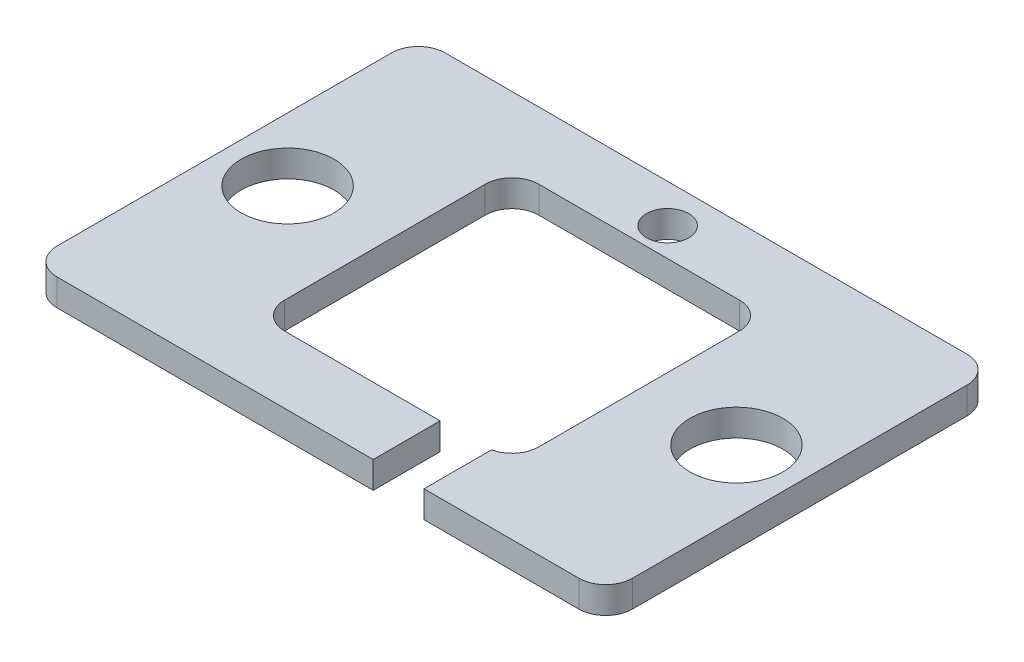
ISO-10303-21;
HEADER;
FILE_DESCRIPTION(('STEP AP214'),'2;1');
FILE_NAME('part.step','',(''),(''),'','','');
FILE_SCHEMA(('AUTOMOTIVE_DESIGN { 1 0 10303 214 1 1 1 1 }'));
ENDSEC;
DATA;
#1=APPLICATION_CONTEXT('core data for automotive mechanical design processes');
#2=APPLICATION_PROTOCOL_DEFINITION('international standard','automotive_design',2000,#1);
#3=PRODUCT_CONTEXT('',#1,'mechanical');
#4=PRODUCT('Part','Part','',(#3));
#5=PRODUCT_RELATED_PRODUCT_CATEGORY('part','',(#4));
#6=PRODUCT_DEFINITION_FORMATION('','',#4);
#7=PRODUCT_DEFINITION_CONTEXT('part definition',#1,'design');
#8=PRODUCT_DEFINITION('design','',#6,#7);
#9=PRODUCT_DEFINITION_SHAPE('','',#8);
#10=(LENGTH_UNIT() NAMED_UNIT(*) SI_UNIT(.MILLI.,.METRE.));
#11=(NAMED_UNIT(*) PLANE_ANGLE_UNIT() SI_UNIT($,.RADIAN.));
#12=(NAMED_UNIT(*) SI_UNIT($,.STERADIAN.) SOLID_ANGLE_UNIT());
#13=UNCERTAINTY_MEASURE_WITH_UNIT(LENGTH_MEASURE(1.E-05),#10,'distance_accuracy_value','');
#14=(GEOMETRIC_REPRESENTATION_CONTEXT(3) GLOBAL_UNCERTAINTY_ASSIGNED_CONTEXT((#13)) GLOBAL_UNIT_ASSIGNED_CONTEXT((#10,
#11,#12)) REPRESENTATION_CONTEXT('',''));
#15=CARTESIAN_POINT('',(0.,0.,0.));
#16=DIRECTION('',(0.,0.,1.));
#17=DIRECTION('',(1.,0.,0.));
#18=AXIS2_PLACEMENT_3D('',#15,#16,#17);
#19=CARTESIAN_POINT('',(-19.5,2.,14.5));
#20=DIRECTION('',(0.,0.,-1.));
#21=DIRECTION('',(-1.,0.,0.));
#22=AXIS2_PLACEMENT_3D('',#19,#20,#21);
#23=PLANE('',#22);
#24=DIRECTION('',(1.,0.,0.));
#25=VECTOR('',#24,1.);
#26=CARTESIAN_POINT('',(-19.5,0.,14.5));
#27=LINE('',#26,#25);
#28=CARTESIAN_POINT('',(-19.5,0.,14.5));
#29=VERTEX_POINT('',#28);
#30=CARTESIAN_POINT('',(4.12837278394701,0.,14.5));
#31=VERTEX_POINT('',#30);
#32=EDGE_CURVE('E189',#29,#31,#27,.T.);
#33=ORIENTED_EDGE('',*,*,#32,.T.);
#34=DIRECTION('',(0.,1.,0.));
#35=VECTOR('',#34,1.);
#36=CARTESIAN_POINT('',(4.12837278394701,0.,14.5));
#37=LINE('',#36,#35);
#38=CARTESIAN_POINT('',(4.12837278394701,2.,14.5));
#39=VERTEX_POINT('',#38);
#40=EDGE_CURVE('E171',#31,#39,#37,.T.);
#41=ORIENTED_EDGE('',*,*,#40,.T.);
#42=DIRECTION('',(1.,0.,0.));
#43=VECTOR('',#42,1.);
#44=CARTESIAN_POINT('',(-19.5,2.,14.5));
#45=LINE('',#44,#43);
#46=CARTESIAN_POINT('',(-19.5,2.,14.5));
#47=VERTEX_POINT('',#46);
#48=EDGE_CURVE('E214',#47,#39,#45,.T.);
#49=ORIENTED_EDGE('',*,*,#48,.F.);
#50=DIRECTION('',(0.,-1.,0.));
#51=VECTOR('',#50,1.);
#52=CARTESIAN_POINT('',(-19.5,2.,14.5));
#53=LINE('',#52,#51);
#54=EDGE_CURVE('E196',#47,#29,#53,.T.);
#55=ORIENTED_EDGE('',*,*,#54,.T.);
#56=EDGE_LOOP('',(#33,#41,#49,#55));
#57=FACE_BOUND('',#56,.T.);
#58=ADVANCED_FACE('F42',(#57),#23,.F.);
#59=CARTESIAN_POINT('',(19.5,2.,12.5));
#60=DIRECTION('',(0.,-1.,0.));
#61=DIRECTION('',(0.,0.,-1.));
#62=AXIS2_PLACEMENT_3D('',#59,#60,#61);
#63=PLANE('',#62);
#64=CARTESIAN_POINT('',(0.,2.,-11.63));
#65=DIRECTION('',(0.,1.,0.));
#66=DIRECTION('',(0.,0.,1.));
#67=AXIS2_PLACEMENT_3D('',#64,#65,#66);
#68=CIRCLE('',#67,1.575);
#69=CARTESIAN_POINT('',(0.,2.,-10.055));
#70=VERTEX_POINT('',#69);
#71=EDGE_CURVE('E383',#70,#70,#68,.T.);
#72=ORIENTED_EDGE('',*,*,#71,.F.);
#73=EDGE_LOOP('',(#72));
#74=FACE_BOUND('',#73,.T.);
#75=ORIENTED_EDGE('',*,*,#48,.T.);
#76=DIRECTION('',(0.,0.,1.));
#77=VECTOR('',#76,1.);
#78=CARTESIAN_POINT('',(4.12837278394701,2.,8.99429780867132));
#79=LINE('',#78,#77);
#80=CARTESIAN_POINT('',(4.12837278394701,2.,9.5));
#81=VERTEX_POINT('',#80);
#82=EDGE_CURVE('E174',#81,#39,#79,.T.);
#83=ORIENTED_EDGE('',*,*,#82,.F.);
#84=DIRECTION('',(1.,0.,0.));
#85=VECTOR('',#84,1.);
#86=CARTESIAN_POINT('',(-7.5,2.,9.5));
#87=LINE('',#86,#85);
#88=CARTESIAN_POINT('',(-7.5,2.,9.5));
#89=VERTEX_POINT('',#88);
#90=EDGE_CURVE('E413',#89,#81,#87,.T.);
#91=ORIENTED_EDGE('',*,*,#90,.F.);
#92=CARTESIAN_POINT('',(-7.5,2.,7.5));
#93=DIRECTION('',(0.,1.,0.));
#94=DIRECTION('',(0.,0.,1.));
#95=AXIS2_PLACEMENT_3D('',#92,#93,#94);
#96=CIRCLE('',#95,2.);
#97=CARTESIAN_POINT('',(-9.5,2.,7.5));
#98=VERTEX_POINT('',#97);
#99=EDGE_CURVE('E284',#98,#89,#96,.T.);
#100=ORIENTED_EDGE('',*,*,#99,.F.);
#101=DIRECTION('',(0.,0.,1.));
#102=VECTOR('',#101,1.);
#103=CARTESIAN_POINT('',(-9.5,2.,7.5));
#104=LINE('',#103,#102);
#105=CARTESIAN_POINT('',(-9.5,2.,-7.5));
#106=VERTEX_POINT('',#105);
#107=EDGE_CURVE('E290',#106,#98,#104,.T.);
#108=ORIENTED_EDGE('',*,*,#107,.F.);
#109=CARTESIAN_POINT('',(-7.5,2.,-7.5));
#110=DIRECTION('',(0.,1.,0.));
#111=DIRECTION('',(0.,0.,-1.));
#112=AXIS2_PLACEMENT_3D('',#109,#110,#111);
#113=CIRCLE('',#112,2.);
#114=CARTESIAN_POINT('',(-7.5,2.,-9.5));
#115=VERTEX_POINT('',#114);
#116=EDGE_CURVE('E429',#115,#106,#113,.T.);
#117=ORIENTED_EDGE('',*,*,#116,.F.);
#118=DIRECTION('',(-1.,0.,0.));
#119=VECTOR('',#118,1.);
#120=CARTESIAN_POINT('',(-7.5,2.,-9.5));
#121=LINE('',#120,#119);
#122=CARTESIAN_POINT('',(7.5,2.,-9.5));
#123=VERTEX_POINT('',#122);
#124=EDGE_CURVE('E426',#123,#115,#121,.T.);
#125=ORIENTED_EDGE('',*,*,#124,.F.);
#126=CARTESIAN_POINT('',(7.5,2.,-7.5));
#127=DIRECTION('',(0.,1.,0.));
#128=DIRECTION('',(0.,0.,1.));
#129=AXIS2_PLACEMENT_3D('',#126,#127,#128);
#130=CIRCLE('',#129,2.);
#131=CARTESIAN_POINT('',(9.5,2.,-7.5));
#132=VERTEX_POINT('',#131);
#133=EDGE_CURVE('E423',#132,#123,#130,.T.);
#134=ORIENTED_EDGE('',*,*,#133,.F.);
#135=DIRECTION('',(0.,0.,-1.));
#136=VECTOR('',#135,1.);
#137=CARTESIAN_POINT('',(9.5,2.,7.5));
#138=LINE('',#137,#136);
#139=CARTESIAN_POINT('',(9.5,2.,7.5));
#140=VERTEX_POINT('',#139);
#141=EDGE_CURVE('E420',#140,#132,#138,.T.);
#142=ORIENTED_EDGE('',*,*,#141,.F.);
#143=CARTESIAN_POINT('',(7.5,2.,7.5));
#144=DIRECTION('',(0.,1.,0.));
#145=DIRECTION('',(0.,0.,1.));
#146=AXIS2_PLACEMENT_3D('',#143,#144,#145);
#147=CIRCLE('',#146,2.);
#148=CARTESIAN_POINT('',(7.925,2.,9.45432213311931));
#149=VERTEX_POINT('',#148);
#150=EDGE_CURVE('E417',#149,#140,#147,.T.);
#151=ORIENTED_EDGE('',*,*,#150,.F.);
#152=DIRECTION('',(0.,0.,-1.));
#153=VECTOR('',#152,1.);
#154=CARTESIAN_POINT('',(7.925,2.,8.99429780867132));
#155=LINE('',#154,#153);
#156=CARTESIAN_POINT('',(7.925,2.,14.5));
#157=VERTEX_POINT('',#156);
#158=EDGE_CURVE('E65',#157,#149,#155,.T.);
#159=ORIENTED_EDGE('',*,*,#158,.F.);
#160=CARTESIAN_POINT('',(19.5,2.,14.5));
#161=VERTEX_POINT('',#160);
#162=EDGE_CURVE('E326',#157,#161,#45,.T.);
#163=ORIENTED_EDGE('',*,*,#162,.T.);
#164=CARTESIAN_POINT('',(19.5,2.,12.5));
#165=DIRECTION('',(0.,1.,0.));
#166=DIRECTION('',(0.,0.,-1.));
#167=AXIS2_PLACEMENT_3D('',#164,#165,#166);
#168=CIRCLE('',#167,2.);
#169=CARTESIAN_POINT('',(21.5,2.,12.5));
#170=VERTEX_POINT('',#169);
#171=EDGE_CURVE('E198',#161,#170,#168,.T.);
#172=ORIENTED_EDGE('',*,*,#171,.T.);
#173=DIRECTION('',(0.,0.,-1.));
#174=VECTOR('',#173,1.);
#175=CARTESIAN_POINT('',(21.5,2.,12.5));
#176=LINE('',#175,#174);
#177=CARTESIAN_POINT('',(21.5,2.,-12.5));
#178=VERTEX_POINT('',#177);
#179=EDGE_CURVE('E204',#170,#178,#176,.T.);
#180=ORIENTED_EDGE('',*,*,#179,.T.);
#181=CARTESIAN_POINT('',(19.5,2.,-12.5));
#182=DIRECTION('',(0.,1.,0.));
#183=DIRECTION('',(0.,0.,1.));
#184=AXIS2_PLACEMENT_3D('',#181,#182,#183);
#185=CIRCLE('',#184,2.);
#186=CARTESIAN_POINT('',(19.5,2.,-14.5));
#187=VERTEX_POINT('',#186);
#188=EDGE_CURVE('E311',#178,#187,#185,.T.);
#189=ORIENTED_EDGE('',*,*,#188,.T.);
#190=DIRECTION('',(-1.,0.,0.));
#191=VECTOR('',#190,1.);
#192=CARTESIAN_POINT('',(-19.5,2.,-14.5));
#193=LINE('',#192,#191);
#194=CARTESIAN_POINT('',(-19.5,2.,-14.5));
#195=VERTEX_POINT('',#194);
#196=EDGE_CURVE('E314',#187,#195,#193,.T.);
#197=ORIENTED_EDGE('',*,*,#196,.T.);
#198=CARTESIAN_POINT('',(-19.5,2.,-12.5));
#199=DIRECTION('',(0.,1.,0.));
#200=DIRECTION('',(0.,0.,-1.));
#201=AXIS2_PLACEMENT_3D('',#198,#199,#200);
#202=CIRCLE('',#201,2.);
#203=CARTESIAN_POINT('',(-21.5,2.,-12.5));
#204=VERTEX_POINT('',#203);
#205=EDGE_CURVE('E317',#195,#204,#202,.T.);
#206=ORIENTED_EDGE('',*,*,#205,.T.);
#207=DIRECTION('',(0.,0.,1.));
#208=VECTOR('',#207,1.);
#209=CARTESIAN_POINT('',(-21.5,2.,12.5));
#210=LINE('',#209,#208);
#211=CARTESIAN_POINT('',(-21.5,2.,12.5));
#212=VERTEX_POINT('',#211);
#213=EDGE_CURVE('E320',#204,#212,#210,.T.);
#214=ORIENTED_EDGE('',*,*,#213,.T.);
#215=CARTESIAN_POINT('',(-19.5,2.,12.5));
#216=DIRECTION('',(0.,1.,0.));
#217=DIRECTION('',(0.,0.,-1.));
#218=AXIS2_PLACEMENT_3D('',#215,#216,#217);
#219=CIRCLE('',#218,2.);
#220=EDGE_CURVE('E323',#212,#47,#219,.T.);
#221=ORIENTED_EDGE('',*,*,#220,.T.);
#222=EDGE_LOOP('',(#75,#83,#91,#100,#108,#117,#125,#134,#142,#151,#159,#163,#172,#180,#189,#197,
#206,#214,#221));
#223=FACE_BOUND('',#222,.T.);
#224=CARTESIAN_POINT('',(-16.77,2.,0.));
#225=DIRECTION('',(0.,1.,0.));
#226=DIRECTION('',(0.,0.,1.));
#227=AXIS2_PLACEMENT_3D('',#224,#225,#226);
#228=CIRCLE('',#227,3.475);
#229=CARTESIAN_POINT('',(-16.77,2.,3.475));
#230=VERTEX_POINT('',#229);
#231=EDGE_CURVE('E404',#230,#230,#228,.T.);
#232=ORIENTED_EDGE('',*,*,#231,.F.);
#233=EDGE_LOOP('',(#232));
#234=FACE_BOUND('',#233,.T.);
#235=CARTESIAN_POINT('',(16.77,2.,0.));
#236=DIRECTION('',(0.,1.,0.));
#237=DIRECTION('',(0.,0.,1.));
#238=AXIS2_PLACEMENT_3D('',#235,#236,#237);
#239=CIRCLE('',#238,3.475);
#240=CARTESIAN_POINT('',(16.77,2.,3.47499999999999));
#241=VERTEX_POINT('',#240);
#242=EDGE_CURVE('E396',#241,#241,#239,.T.);
#243=ORIENTED_EDGE('',*,*,#242,.F.);
#244=EDGE_LOOP('',(#243));
#245=FACE_BOUND('',#244,.T.);
#246=ADVANCED_FACE('F363',(#74,#223,#234,#245),#63,.F.);
#247=CARTESIAN_POINT('',(19.5,0.,12.5));
#248=DIRECTION('',(0.,-1.,0.));
#249=DIRECTION('',(0.,0.,-1.));
#250=AXIS2_PLACEMENT_3D('',#247,#248,#249);
#251=PLANE('',#250);
#252=DIRECTION('',(0.,0.,1.));
#253=VECTOR('',#252,1.);
#254=CARTESIAN_POINT('',(4.12837278394701,0.,8.99429780867132));
#255=LINE('',#254,#253);
#256=CARTESIAN_POINT('',(4.12837278394701,0.,9.5));
#257=VERTEX_POINT('',#256);
#258=EDGE_CURVE('E57',#257,#31,#255,.T.);
#259=ORIENTED_EDGE('',*,*,#258,.T.);
#260=ORIENTED_EDGE('',*,*,#32,.F.);
#261=CARTESIAN_POINT('',(-19.5,0.,12.5));
#262=DIRECTION('',(0.,1.,0.));
#263=DIRECTION('',(0.,0.,-1.));
#264=AXIS2_PLACEMENT_3D('',#261,#262,#263);
#265=CIRCLE('',#264,2.);
#266=CARTESIAN_POINT('',(-21.5,0.,12.5));
#267=VERTEX_POINT('',#266);
#268=EDGE_CURVE('E206',#267,#29,#265,.T.);
#269=ORIENTED_EDGE('',*,*,#268,.F.);
#270=DIRECTION('',(0.,0.,1.));
#271=VECTOR('',#270,1.);
#272=CARTESIAN_POINT('',(-21.5,0.,12.5));
#273=LINE('',#272,#271);
#274=CARTESIAN_POINT('',(-21.5,0.,-12.5));
#275=VERTEX_POINT('',#274);
#276=EDGE_CURVE('E343',#275,#267,#273,.T.);
#277=ORIENTED_EDGE('',*,*,#276,.F.);
#278=CARTESIAN_POINT('',(-19.5,0.,-12.5));
#279=DIRECTION('',(0.,1.,0.));
#280=DIRECTION('',(0.,0.,-1.));
#281=AXIS2_PLACEMENT_3D('',#278,#279,#280);
#282=CIRCLE('',#281,2.);
#283=CARTESIAN_POINT('',(-19.5,0.,-14.5));
#284=VERTEX_POINT('',#283);
#285=EDGE_CURVE('E341',#284,#275,#282,.T.);
#286=ORIENTED_EDGE('',*,*,#285,.F.);
#287=DIRECTION('',(-1.,0.,0.));
#288=VECTOR('',#287,1.);
#289=CARTESIAN_POINT('',(-19.5,0.,-14.5));
#290=LINE('',#289,#288);
#291=CARTESIAN_POINT('',(19.5,0.,-14.5));
#292=VERTEX_POINT('',#291);
#293=EDGE_CURVE('E338',#292,#284,#290,.T.);
#294=ORIENTED_EDGE('',*,*,#293,.F.);
#295=CARTESIAN_POINT('',(19.5,0.,-12.5));
#296=DIRECTION('',(0.,1.,0.));
#297=DIRECTION('',(0.,0.,1.));
#298=AXIS2_PLACEMENT_3D('',#295,#296,#297);
#299=CIRCLE('',#298,2.);
#300=CARTESIAN_POINT('',(21.5,0.,-12.5));
#301=VERTEX_POINT('',#300);
#302=EDGE_CURVE('E335',#301,#292,#299,.T.);
#303=ORIENTED_EDGE('',*,*,#302,.F.);
#304=DIRECTION('',(0.,0.,-1.));
#305=VECTOR('',#304,1.);
#306=CARTESIAN_POINT('',(21.5,0.,12.5));
#307=LINE('',#306,#305);
#308=CARTESIAN_POINT('',(21.5,0.,12.5));
#309=VERTEX_POINT('',#308);
#310=EDGE_CURVE('E332',#309,#301,#307,.T.);
#311=ORIENTED_EDGE('',*,*,#310,.F.);
#312=CARTESIAN_POINT('',(19.5,0.,12.5));
#313=DIRECTION('',(0.,1.,0.));
#314=DIRECTION('',(0.,0.,-1.));
#315=AXIS2_PLACEMENT_3D('',#312,#313,#314);
#316=CIRCLE('',#315,2.);
#317=CARTESIAN_POINT('',(19.5,0.,14.5));
#318=VERTEX_POINT('',#317);
#319=EDGE_CURVE('E307',#318,#309,#316,.T.);
#320=ORIENTED_EDGE('',*,*,#319,.F.);
#321=CARTESIAN_POINT('',(7.925,0.,14.5));
#322=VERTEX_POINT('',#321);
#323=EDGE_CURVE('E199',#322,#318,#27,.T.);
#324=ORIENTED_EDGE('',*,*,#323,.F.);
#325=DIRECTION('',(0.,0.,-1.));
#326=VECTOR('',#325,1.);
#327=CARTESIAN_POINT('',(7.925,0.,8.99429780867132));
#328=LINE('',#327,#326);
#329=CARTESIAN_POINT('',(7.925,0.,9.45432213311931));
#330=VERTEX_POINT('',#329);
#331=EDGE_CURVE('E181',#322,#330,#328,.T.);
#332=ORIENTED_EDGE('',*,*,#331,.T.);
#333=CARTESIAN_POINT('',(7.5,0.,7.5));
#334=DIRECTION('',(0.,1.,0.));
#335=DIRECTION('',(0.,0.,1.));
#336=AXIS2_PLACEMENT_3D('',#333,#334,#335);
#337=CIRCLE('',#336,2.);
#338=CARTESIAN_POINT('',(9.5,0.,7.5));
#339=VERTEX_POINT('',#338);
#340=EDGE_CURVE('E249',#330,#339,#337,.T.);
#341=ORIENTED_EDGE('',*,*,#340,.T.);
#342=DIRECTION('',(0.,0.,-1.));
#343=VECTOR('',#342,1.);
#344=CARTESIAN_POINT('',(9.5,0.,7.5));
#345=LINE('',#344,#343);
#346=CARTESIAN_POINT('',(9.5,0.,-7.5));
#347=VERTEX_POINT('',#346);
#348=EDGE_CURVE('E259',#339,#347,#345,.T.);
#349=ORIENTED_EDGE('',*,*,#348,.T.);
#350=CARTESIAN_POINT('',(7.5,0.,-7.5));
#351=DIRECTION('',(0.,1.,0.));
#352=DIRECTION('',(0.,0.,1.));
#353=AXIS2_PLACEMENT_3D('',#350,#351,#352);
#354=CIRCLE('',#353,2.);
#355=CARTESIAN_POINT('',(7.5,0.,-9.5));
#356=VERTEX_POINT('',#355);
#357=EDGE_CURVE('E263',#347,#356,#354,.T.);
#358=ORIENTED_EDGE('',*,*,#357,.T.);
#359=DIRECTION('',(-1.,0.,0.));
#360=VECTOR('',#359,1.);
#361=CARTESIAN_POINT('',(-7.5,0.,-9.5));
#362=LINE('',#361,#360);
#363=CARTESIAN_POINT('',(-7.5,0.,-9.5));
#364=VERTEX_POINT('',#363);
#365=EDGE_CURVE('E272',#356,#364,#362,.T.);
#366=ORIENTED_EDGE('',*,*,#365,.T.);
#367=CARTESIAN_POINT('',(-7.5,0.,-7.5));
#368=DIRECTION('',(0.,1.,0.));
#369=DIRECTION('',(0.,0.,-1.));
#370=AXIS2_PLACEMENT_3D('',#367,#368,#369);
#371=CIRCLE('',#370,2.);
#372=CARTESIAN_POINT('',(-9.5,0.,-7.5));
#373=VERTEX_POINT('',#372);
#374=EDGE_CURVE('E276',#364,#373,#371,.T.);
#375=ORIENTED_EDGE('',*,*,#374,.T.);
#376=DIRECTION('',(0.,0.,1.));
#377=VECTOR('',#376,1.);
#378=CARTESIAN_POINT('',(-9.5,0.,7.5));
#379=LINE('',#378,#377);
#380=CARTESIAN_POINT('',(-9.5,0.,7.5));
#381=VERTEX_POINT('',#380);
#382=EDGE_CURVE('E280',#373,#381,#379,.T.);
#383=ORIENTED_EDGE('',*,*,#382,.T.);
#384=CARTESIAN_POINT('',(-7.5,0.,7.5));
#385=DIRECTION('',(0.,1.,0.));
#386=DIRECTION('',(0.,0.,1.));
#387=AXIS2_PLACEMENT_3D('',#384,#385,#386);
#388=CIRCLE('',#387,2.);
#389=CARTESIAN_POINT('',(-7.5,0.,9.5));
#390=VERTEX_POINT('',#389);
#391=EDGE_CURVE('E265',#381,#390,#388,.T.);
#392=ORIENTED_EDGE('',*,*,#391,.T.);
#393=DIRECTION('',(1.,0.,0.));
#394=VECTOR('',#393,1.);
#395=CARTESIAN_POINT('',(-7.5,0.,9.5));
#396=LINE('',#395,#394);
#397=EDGE_CURVE('E191',#390,#257,#396,.T.);
#398=ORIENTED_EDGE('',*,*,#397,.T.);
#399=EDGE_LOOP('',(#259,#260,#269,#277,#286,#294,#303,#311,#320,#324,#332,#341,#349,#358,#366,
#375,#383,#392,#398));
#400=FACE_BOUND('',#399,.T.);
#401=CARTESIAN_POINT('',(0.,0.,-11.63));
#402=DIRECTION('',(0.,1.,0.));
#403=DIRECTION('',(0.,0.,1.));
#404=AXIS2_PLACEMENT_3D('',#401,#402,#403);
#405=CIRCLE('',#404,1.575);
#406=CARTESIAN_POINT('',(0.,0.,-10.055));
#407=VERTEX_POINT('',#406);
#408=EDGE_CURVE('E387',#407,#407,#405,.T.);
#409=ORIENTED_EDGE('',*,*,#408,.T.);
#410=EDGE_LOOP('',(#409));
#411=FACE_BOUND('',#410,.T.);
#412=CARTESIAN_POINT('',(-16.77,0.,0.));
#413=DIRECTION('',(0.,1.,0.));
#414=DIRECTION('',(0.,0.,1.));
#415=AXIS2_PLACEMENT_3D('',#412,#413,#414);
#416=CIRCLE('',#415,3.475);
#417=CARTESIAN_POINT('',(-16.77,0.,3.475));
#418=VERTEX_POINT('',#417);
#419=EDGE_CURVE('E400',#418,#418,#416,.T.);
#420=ORIENTED_EDGE('',*,*,#419,.T.);
#421=EDGE_LOOP('',(#420));
#422=FACE_BOUND('',#421,.T.);
#423=CARTESIAN_POINT('',(16.77,0.,0.));
#424=DIRECTION('',(0.,1.,0.));
#425=DIRECTION('',(0.,0.,1.));
#426=AXIS2_PLACEMENT_3D('',#423,#424,#425);
#427=CIRCLE('',#426,3.475);
#428=CARTESIAN_POINT('',(16.77,0.,3.47499999999999));
#429=VERTEX_POINT('',#428);
#430=EDGE_CURVE('E394',#429,#429,#427,.T.);
#431=ORIENTED_EDGE('',*,*,#430,.T.);
#432=EDGE_LOOP('',(#431));
#433=FACE_BOUND('',#432,.T.);
#434=ADVANCED_FACE('F186',(#400,#411,#422,#433),#251,.T.);
#435=CARTESIAN_POINT('',(19.5,2.,12.5));
#436=DIRECTION('',(0.,-1.,0.));
#437=DIRECTION('',(0.,0.,-1.));
#438=AXIS2_PLACEMENT_3D('',#435,#436,#437);
#439=CYLINDRICAL_SURFACE('',#438,2.);
#440=ORIENTED_EDGE('',*,*,#319,.T.);
#441=DIRECTION('',(0.,-1.,0.));
#442=VECTOR('',#441,1.);
#443=CARTESIAN_POINT('',(21.5,2.,12.5));
#444=LINE('',#443,#442);
#445=EDGE_CURVE('E237',#170,#309,#444,.T.);
#446=ORIENTED_EDGE('',*,*,#445,.F.);
#447=ORIENTED_EDGE('',*,*,#171,.F.);
#448=DIRECTION('',(0.,-1.,0.));
#449=VECTOR('',#448,1.);
#450=CARTESIAN_POINT('',(19.5,2.,14.5));
#451=LINE('',#450,#449);
#452=EDGE_CURVE('E210',#161,#318,#451,.T.);
#453=ORIENTED_EDGE('',*,*,#452,.T.);
#454=EDGE_LOOP('',(#440,#446,#447,#453));
#455=FACE_BOUND('',#454,.T.);
#456=ADVANCED_FACE('F44',(#455),#439,.T.);
#457=CARTESIAN_POINT('',(21.5,2.,12.5));
#458=DIRECTION('',(-1.,0.,0.));
#459=DIRECTION('',(0.,0.,1.));
#460=AXIS2_PLACEMENT_3D('',#457,#458,#459);
#461=PLANE('',#460);
#462=ORIENTED_EDGE('',*,*,#310,.T.);
#463=DIRECTION('',(0.,-1.,0.));
#464=VECTOR('',#463,1.);
#465=CARTESIAN_POINT('',(21.5,2.,-12.5));
#466=LINE('',#465,#464);
#467=EDGE_CURVE('E233',#178,#301,#466,.T.);
#468=ORIENTED_EDGE('',*,*,#467,.F.);
#469=ORIENTED_EDGE('',*,*,#179,.F.);
#470=ORIENTED_EDGE('',*,*,#445,.T.);
#471=EDGE_LOOP('',(#462,#468,#469,#470));
#472=FACE_BOUND('',#471,.T.);
#473=ADVANCED_FACE('F375',(#472),#461,.F.);
#474=CARTESIAN_POINT('',(19.5,2.,-12.5));
#475=DIRECTION('',(0.,-1.,0.));
#476=DIRECTION('',(0.,0.,-1.));
#477=AXIS2_PLACEMENT_3D('',#474,#475,#476);
#478=CYLINDRICAL_SURFACE('',#477,2.);
#479=ORIENTED_EDGE('',*,*,#302,.T.);
#480=DIRECTION('',(0.,-1.,0.));
#481=VECTOR('',#480,1.);
#482=CARTESIAN_POINT('',(19.5,2.,-14.5));
#483=LINE('',#482,#481);
#484=EDGE_CURVE('E229',#187,#292,#483,.T.);
#485=ORIENTED_EDGE('',*,*,#484,.F.);
#486=ORIENTED_EDGE('',*,*,#188,.F.);
#487=ORIENTED_EDGE('',*,*,#467,.T.);
#488=EDGE_LOOP('',(#479,#485,#486,#487));
#489=FACE_BOUND('',#488,.T.);
#490=ADVANCED_FACE('F371',(#489),#478,.T.);
#491=CARTESIAN_POINT('',(-19.5,2.,-14.5));
#492=DIRECTION('',(0.,0.,1.));
#493=DIRECTION('',(1.,0.,0.));
#494=AXIS2_PLACEMENT_3D('',#491,#492,#493);
#495=PLANE('',#494);
#496=ORIENTED_EDGE('',*,*,#293,.T.);
#497=DIRECTION('',(0.,-1.,0.));
#498=VECTOR('',#497,1.);
#499=CARTESIAN_POINT('',(-19.5,2.,-14.5));
#500=LINE('',#499,#498);
#501=EDGE_CURVE('E225',#195,#284,#500,.T.);
#502=ORIENTED_EDGE('',*,*,#501,.F.);
#503=ORIENTED_EDGE('',*,*,#196,.F.);
#504=ORIENTED_EDGE('',*,*,#484,.T.);
#505=EDGE_LOOP('',(#496,#502,#503,#504));
#506=FACE_BOUND('',#505,.T.);
#507=ADVANCED_FACE('F369',(#506),#495,.F.);
#508=CARTESIAN_POINT('',(-19.5,2.,-12.5));
#509=DIRECTION('',(0.,-1.,0.));
#510=DIRECTION('',(0.,0.,-1.));
#511=AXIS2_PLACEMENT_3D('',#508,#509,#510);
#512=CYLINDRICAL_SURFACE('',#511,2.);
#513=ORIENTED_EDGE('',*,*,#285,.T.);
#514=DIRECTION('',(0.,-1.,0.));
#515=VECTOR('',#514,1.);
#516=CARTESIAN_POINT('',(-21.5,2.,-12.5));
#517=LINE('',#516,#515);
#518=EDGE_CURVE('E221',#204,#275,#517,.T.);
#519=ORIENTED_EDGE('',*,*,#518,.F.);
#520=ORIENTED_EDGE('',*,*,#205,.F.);
#521=ORIENTED_EDGE('',*,*,#501,.T.);
#522=EDGE_LOOP('',(#513,#519,#520,#521));
#523=FACE_BOUND('',#522,.T.);
#524=ADVANCED_FACE('F357',(#523),#512,.T.);
#525=CARTESIAN_POINT('',(-21.5,2.,12.5));
#526=DIRECTION('',(1.,0.,0.));
#527=DIRECTION('',(0.,0.,-1.));
#528=AXIS2_PLACEMENT_3D('',#525,#526,#527);
#529=PLANE('',#528);
#530=ORIENTED_EDGE('',*,*,#276,.T.);
#531=DIRECTION('',(0.,-1.,0.));
#532=VECTOR('',#531,1.);
#533=CARTESIAN_POINT('',(-21.5,2.,12.5));
#534=LINE('',#533,#532);
#535=EDGE_CURVE('E217',#212,#267,#534,.T.);
#536=ORIENTED_EDGE('',*,*,#535,.F.);
#537=ORIENTED_EDGE('',*,*,#213,.F.);
#538=ORIENTED_EDGE('',*,*,#518,.T.);
#539=EDGE_LOOP('',(#530,#536,#537,#538));
#540=FACE_BOUND('',#539,.T.);
#541=ADVANCED_FACE('F361',(#540),#529,.F.);
#542=CARTESIAN_POINT('',(-19.5,2.,12.5));
#543=DIRECTION('',(0.,-1.,0.));
#544=DIRECTION('',(0.,0.,-1.));
#545=AXIS2_PLACEMENT_3D('',#542,#543,#544);
#546=CYLINDRICAL_SURFACE('',#545,2.);
#547=ORIENTED_EDGE('',*,*,#268,.T.);
#548=ORIENTED_EDGE('',*,*,#54,.F.);
#549=ORIENTED_EDGE('',*,*,#220,.F.);
#550=ORIENTED_EDGE('',*,*,#535,.T.);
#551=EDGE_LOOP('',(#547,#548,#549,#550));
#552=FACE_BOUND('',#551,.T.);
#553=ADVANCED_FACE('F350',(#552),#546,.T.);
#554=ORIENTED_EDGE('',*,*,#162,.F.);
#555=DIRECTION('',(0.,1.,0.));
#556=VECTOR('',#555,1.);
#557=CARTESIAN_POINT('',(7.925,0.,14.5));
#558=LINE('',#557,#556);
#559=EDGE_CURVE('E180',#322,#157,#558,.T.);
#560=ORIENTED_EDGE('',*,*,#559,.F.);
#561=ORIENTED_EDGE('',*,*,#323,.T.);
#562=ORIENTED_EDGE('',*,*,#452,.F.);
#563=EDGE_LOOP('',(#554,#560,#561,#562));
#564=FACE_BOUND('',#563,.T.);
#565=ADVANCED_FACE('F381',(#564),#23,.F.);
#566=CARTESIAN_POINT('',(-7.5,2.,7.5));
#567=DIRECTION('',(0.,-1.,0.));
#568=DIRECTION('',(0.,0.,-1.));
#569=AXIS2_PLACEMENT_3D('',#566,#567,#568);
#570=CYLINDRICAL_SURFACE('',#569,2.);
#571=ORIENTED_EDGE('',*,*,#391,.F.);
#572=DIRECTION('',(0.,-1.,0.));
#573=VECTOR('',#572,1.);
#574=CARTESIAN_POINT('',(-9.5,2.,7.5));
#575=LINE('',#574,#573);
#576=EDGE_CURVE('E285',#98,#381,#575,.T.);
#577=ORIENTED_EDGE('',*,*,#576,.F.);
#578=ORIENTED_EDGE('',*,*,#99,.T.);
#579=DIRECTION('',(0.,-1.,0.));
#580=VECTOR('',#579,1.);
#581=CARTESIAN_POINT('',(-7.5,2.,9.5));
#582=LINE('',#581,#580);
#583=EDGE_CURVE('E304',#89,#390,#582,.T.);
#584=ORIENTED_EDGE('',*,*,#583,.T.);
#585=EDGE_LOOP('',(#571,#577,#578,#584));
#586=FACE_BOUND('',#585,.T.);
#587=ADVANCED_FACE('F438',(#586),#570,.F.);
#588=CARTESIAN_POINT('',(-7.5,2.,9.5));
#589=DIRECTION('',(0.,0.,-1.));
#590=DIRECTION('',(-1.,0.,0.));
#591=AXIS2_PLACEMENT_3D('',#588,#589,#590);
#592=PLANE('',#591);
#593=DIRECTION('',(0.,1.,0.));
#594=VECTOR('',#593,1.);
#595=CARTESIAN_POINT('',(4.12837278394701,2.,9.5));
#596=LINE('',#595,#594);
#597=EDGE_CURVE('E11',#257,#81,#596,.T.);
#598=ORIENTED_EDGE('',*,*,#597,.F.);
#599=ORIENTED_EDGE('',*,*,#397,.F.);
#600=ORIENTED_EDGE('',*,*,#583,.F.);
#601=ORIENTED_EDGE('',*,*,#90,.T.);
#602=EDGE_LOOP('',(#598,#599,#600,#601));
#603=FACE_BOUND('',#602,.T.);
#604=ADVANCED_FACE('F448',(#603),#592,.T.);
#605=CARTESIAN_POINT('',(7.5,2.,7.5));
#606=DIRECTION('',(0.,-1.,0.));
#607=DIRECTION('',(0.,0.,-1.));
#608=AXIS2_PLACEMENT_3D('',#605,#606,#607);
#609=CYLINDRICAL_SURFACE('',#608,2.);
#610=DIRECTION('',(0.,-1.,0.));
#611=VECTOR('',#610,1.);
#612=CARTESIAN_POINT('',(7.925,2.,9.45432213311931));
#613=LINE('',#612,#611);
#614=EDGE_CURVE('E51',#149,#330,#613,.T.);
#615=ORIENTED_EDGE('',*,*,#614,.F.);
#616=ORIENTED_EDGE('',*,*,#150,.T.);
#617=DIRECTION('',(0.,-1.,0.));
#618=VECTOR('',#617,1.);
#619=CARTESIAN_POINT('',(9.5,2.,7.5));
#620=LINE('',#619,#618);
#621=EDGE_CURVE('E256',#140,#339,#620,.T.);
#622=ORIENTED_EDGE('',*,*,#621,.T.);
#623=ORIENTED_EDGE('',*,*,#340,.F.);
#624=EDGE_LOOP('',(#615,#616,#622,#623));
#625=FACE_BOUND('',#624,.T.);
#626=ADVANCED_FACE('F254',(#625),#609,.F.);
#627=CARTESIAN_POINT('',(9.5,2.,7.5));
#628=DIRECTION('',(-1.,0.,0.));
#629=DIRECTION('',(0.,0.,1.));
#630=AXIS2_PLACEMENT_3D('',#627,#628,#629);
#631=PLANE('',#630);
#632=ORIENTED_EDGE('',*,*,#348,.F.);
#633=ORIENTED_EDGE('',*,*,#621,.F.);
#634=ORIENTED_EDGE('',*,*,#141,.T.);
#635=DIRECTION('',(0.,-1.,0.));
#636=VECTOR('',#635,1.);
#637=CARTESIAN_POINT('',(9.5,2.,-7.5));
#638=LINE('',#637,#636);
#639=EDGE_CURVE('E299',#132,#347,#638,.T.);
#640=ORIENTED_EDGE('',*,*,#639,.T.);
#641=EDGE_LOOP('',(#632,#633,#634,#640));
#642=FACE_BOUND('',#641,.T.);
#643=ADVANCED_FACE('F457',(#642),#631,.T.);
#644=CARTESIAN_POINT('',(7.5,2.,-7.5));
#645=DIRECTION('',(0.,-1.,0.));
#646=DIRECTION('',(0.,0.,-1.));
#647=AXIS2_PLACEMENT_3D('',#644,#645,#646);
#648=CYLINDRICAL_SURFACE('',#647,2.);
#649=ORIENTED_EDGE('',*,*,#357,.F.);
#650=ORIENTED_EDGE('',*,*,#639,.F.);
#651=ORIENTED_EDGE('',*,*,#133,.T.);
#652=DIRECTION('',(0.,-1.,0.));
#653=VECTOR('',#652,1.);
#654=CARTESIAN_POINT('',(7.5,2.,-9.5));
#655=LINE('',#654,#653);
#656=EDGE_CURVE('E296',#123,#356,#655,.T.);
#657=ORIENTED_EDGE('',*,*,#656,.T.);
#658=EDGE_LOOP('',(#649,#650,#651,#657));
#659=FACE_BOUND('',#658,.T.);
#660=ADVANCED_FACE('F566',(#659),#648,.F.);
#661=CARTESIAN_POINT('',(-7.5,2.,-9.5));
#662=DIRECTION('',(0.,0.,1.));
#663=DIRECTION('',(1.,0.,0.));
#664=AXIS2_PLACEMENT_3D('',#661,#662,#663);
#665=PLANE('',#664);
#666=ORIENTED_EDGE('',*,*,#365,.F.);
#667=ORIENTED_EDGE('',*,*,#656,.F.);
#668=ORIENTED_EDGE('',*,*,#124,.T.);
#669=DIRECTION('',(0.,-1.,0.));
#670=VECTOR('',#669,1.);
#671=CARTESIAN_POINT('',(-7.5,2.,-9.5));
#672=LINE('',#671,#670);
#673=EDGE_CURVE('E293',#115,#364,#672,.T.);
#674=ORIENTED_EDGE('',*,*,#673,.T.);
#675=EDGE_LOOP('',(#666,#667,#668,#674));
#676=FACE_BOUND('',#675,.T.);
#677=ADVANCED_FACE('F555',(#676),#665,.T.);
#678=CARTESIAN_POINT('',(-7.5,2.,-7.5));
#679=DIRECTION('',(0.,-1.,0.));
#680=DIRECTION('',(0.,0.,-1.));
#681=AXIS2_PLACEMENT_3D('',#678,#679,#680);
#682=CYLINDRICAL_SURFACE('',#681,2.);
#683=ORIENTED_EDGE('',*,*,#374,.F.);
#684=ORIENTED_EDGE('',*,*,#673,.F.);
#685=ORIENTED_EDGE('',*,*,#116,.T.);
#686=DIRECTION('',(0.,-1.,0.));
#687=VECTOR('',#686,1.);
#688=CARTESIAN_POINT('',(-9.5,2.,-7.5));
#689=LINE('',#688,#687);
#690=EDGE_CURVE('E289',#106,#373,#689,.T.);
#691=ORIENTED_EDGE('',*,*,#690,.T.);
#692=EDGE_LOOP('',(#683,#684,#685,#691));
#693=FACE_BOUND('',#692,.T.);
#694=ADVANCED_FACE('F545',(#693),#682,.F.);
#695=CARTESIAN_POINT('',(-9.5,2.,7.5));
#696=DIRECTION('',(1.,0.,0.));
#697=DIRECTION('',(0.,0.,-1.));
#698=AXIS2_PLACEMENT_3D('',#695,#696,#697);
#699=PLANE('',#698);
#700=ORIENTED_EDGE('',*,*,#382,.F.);
#701=ORIENTED_EDGE('',*,*,#690,.F.);
#702=ORIENTED_EDGE('',*,*,#107,.T.);
#703=ORIENTED_EDGE('',*,*,#576,.T.);
#704=EDGE_LOOP('',(#700,#701,#702,#703));
#705=FACE_BOUND('',#704,.T.);
#706=ADVANCED_FACE('F442',(#705),#699,.T.);
#707=CARTESIAN_POINT('',(-16.77,2.,0.));
#708=DIRECTION('',(0.,-1.,0.));
#709=DIRECTION('',(0.,0.,-1.));
#710=AXIS2_PLACEMENT_3D('',#707,#708,#709);
#711=CYLINDRICAL_SURFACE('',#710,3.475);
#712=ORIENTED_EDGE('',*,*,#231,.T.);
#713=EDGE_LOOP('',(#712));
#714=FACE_BOUND('',#713,.T.);
#715=ORIENTED_EDGE('',*,*,#419,.F.);
#716=EDGE_LOOP('',(#715));
#717=FACE_BOUND('',#716,.T.);
#718=ADVANCED_FACE('F524',(#714,#717),#711,.F.);
#719=CARTESIAN_POINT('',(16.77,2.,0.));
#720=DIRECTION('',(0.,-1.,0.));
#721=DIRECTION('',(0.,0.,-1.));
#722=AXIS2_PLACEMENT_3D('',#719,#720,#721);
#723=CYLINDRICAL_SURFACE('',#722,3.475);
#724=ORIENTED_EDGE('',*,*,#242,.T.);
#725=EDGE_LOOP('',(#724));
#726=FACE_BOUND('',#725,.T.);
#727=ORIENTED_EDGE('',*,*,#430,.F.);
#728=EDGE_LOOP('',(#727));
#729=FACE_BOUND('',#728,.T.);
#730=ADVANCED_FACE('F513',(#726,#729),#723,.F.);
#731=CARTESIAN_POINT('',(0.,0.,-11.63));
#732=DIRECTION('',(0.,1.,0.));
#733=DIRECTION('',(0.,0.,1.));
#734=AXIS2_PLACEMENT_3D('',#731,#732,#733);
#735=CYLINDRICAL_SURFACE('',#734,1.575);
#736=ORIENTED_EDGE('',*,*,#408,.F.);
#737=EDGE_LOOP('',(#736));
#738=FACE_BOUND('',#737,.T.);
#739=ORIENTED_EDGE('',*,*,#71,.T.);
#740=EDGE_LOOP('',(#739));
#741=FACE_BOUND('',#740,.T.);
#742=ADVANCED_FACE('F508',(#738,#741),#735,.F.);
#743=CARTESIAN_POINT('',(7.925,0.,8.99429780867132));
#744=DIRECTION('',(1.,0.,0.));
#745=DIRECTION('',(0.,0.,-1.));
#746=AXIS2_PLACEMENT_3D('',#743,#744,#745);
#747=PLANE('',#746);
#748=ORIENTED_EDGE('',*,*,#614,.T.);
#749=ORIENTED_EDGE('',*,*,#331,.F.);
#750=ORIENTED_EDGE('',*,*,#559,.T.);
#751=ORIENTED_EDGE('',*,*,#158,.T.);
#752=EDGE_LOOP('',(#748,#749,#750,#751));
#753=FACE_BOUND('',#752,.T.);
#754=ADVANCED_FACE('F242',(#753),#747,.F.);
#755=CARTESIAN_POINT('',(4.12837278394701,0.,8.99429780867132));
#756=DIRECTION('',(-1.,0.,0.));
#757=DIRECTION('',(0.,0.,1.));
#758=AXIS2_PLACEMENT_3D('',#755,#756,#757);
#759=PLANE('',#758);
#760=ORIENTED_EDGE('',*,*,#597,.T.);
#761=ORIENTED_EDGE('',*,*,#82,.T.);
#762=ORIENTED_EDGE('',*,*,#40,.F.);
#763=ORIENTED_EDGE('',*,*,#258,.F.);
#764=EDGE_LOOP('',(#760,#761,#762,#763));
#765=FACE_BOUND('',#764,.T.);
#766=ADVANCED_FACE('F172',(#765),#759,.F.);
#767=CLOSED_SHELL('',(#58,#246,#434,#456,#473,#490,#507,#524,#541,#553,#565,#587,#604,#626,#643,
#660,#677,#694,#706,#718,#730,#742,#754,#766));
#768=MANIFOLD_SOLID_BREP('B2',#767);
#769=ADVANCED_BREP_SHAPE_REPRESENTATION('',(#18,#768),#14);
#770=SHAPE_DEFINITION_REPRESENTATION(#9,#769);
ENDSEC;
END-ISO-10303-21;
